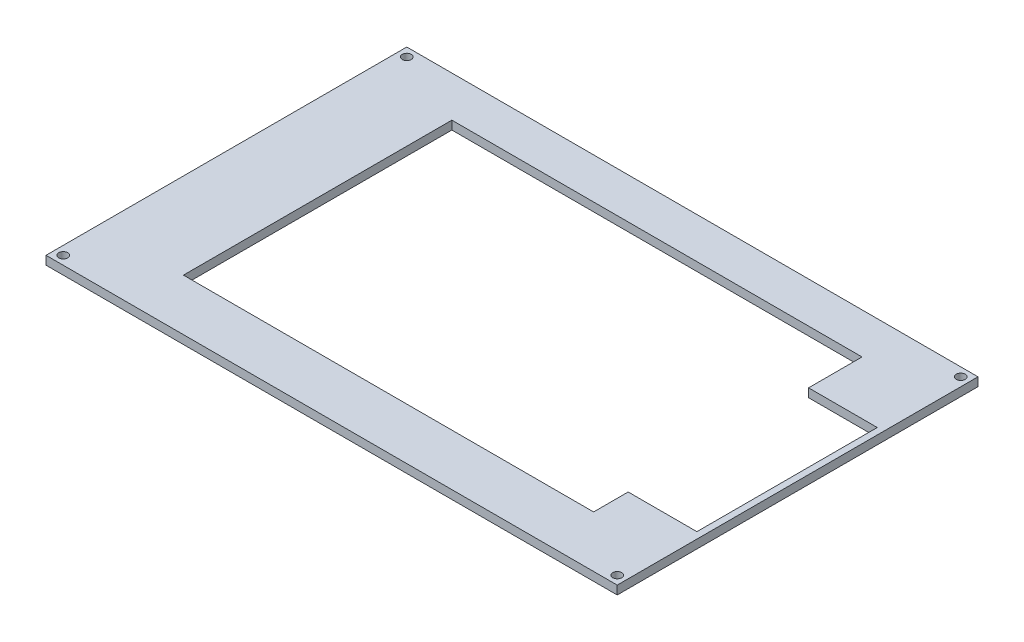
ISO-10303-21;
HEADER;
FILE_DESCRIPTION(('STEP AP214'),'2;1');
FILE_NAME('part.step','',(''),(''),'','','');
FILE_SCHEMA(('AUTOMOTIVE_DESIGN { 1 0 10303 214 1 1 1 1 }'));
ENDSEC;
DATA;
#1=APPLICATION_CONTEXT('core data for automotive mechanical design processes');
#2=APPLICATION_PROTOCOL_DEFINITION('international standard','automotive_design',2000,#1);
#3=PRODUCT_CONTEXT('',#1,'mechanical');
#4=PRODUCT('Part','Part','',(#3));
#5=PRODUCT_RELATED_PRODUCT_CATEGORY('part','',(#4));
#6=PRODUCT_DEFINITION_FORMATION('','',#4);
#7=PRODUCT_DEFINITION_CONTEXT('part definition',#1,'design');
#8=PRODUCT_DEFINITION('design','',#6,#7);
#9=PRODUCT_DEFINITION_SHAPE('','',#8);
#10=(LENGTH_UNIT() NAMED_UNIT(*) SI_UNIT(.MILLI.,.METRE.));
#11=(NAMED_UNIT(*) PLANE_ANGLE_UNIT() SI_UNIT($,.RADIAN.));
#12=(NAMED_UNIT(*) SI_UNIT($,.STERADIAN.) SOLID_ANGLE_UNIT());
#13=UNCERTAINTY_MEASURE_WITH_UNIT(LENGTH_MEASURE(1.E-05),#10,'distance_accuracy_value','');
#14=(GEOMETRIC_REPRESENTATION_CONTEXT(3) GLOBAL_UNCERTAINTY_ASSIGNED_CONTEXT((#13)) GLOBAL_UNIT_ASSIGNED_CONTEXT((#10,
#11,#12)) REPRESENTATION_CONTEXT('',''));
#15=CARTESIAN_POINT('',(0.,0.,0.));
#16=DIRECTION('',(0.,0.,1.));
#17=DIRECTION('',(1.,0.,0.));
#18=AXIS2_PLACEMENT_3D('',#15,#16,#17);
#19=CARTESIAN_POINT('',(133.,2.,0.));
#20=DIRECTION('',(1.,0.,0.));
#21=DIRECTION('',(0.,0.,-1.));
#22=AXIS2_PLACEMENT_3D('',#19,#20,#21);
#23=PLANE('',#22);
#24=DIRECTION('',(0.,0.,1.));
#25=VECTOR('',#24,1.);
#26=CARTESIAN_POINT('',(133.,0.,0.));
#27=LINE('',#26,#25);
#28=CARTESIAN_POINT('',(133.,0.,0.));
#29=VERTEX_POINT('',#28);
#30=CARTESIAN_POINT('',(133.,0.,84.));
#31=VERTEX_POINT('',#30);
#32=EDGE_CURVE('E216',#29,#31,#27,.T.);
#33=ORIENTED_EDGE('',*,*,#32,.F.);
#34=DIRECTION('',(0.,-1.,0.));
#35=VECTOR('',#34,1.);
#36=CARTESIAN_POINT('',(133.,2.,0.));
#37=LINE('',#36,#35);
#38=CARTESIAN_POINT('',(133.,2.,0.));
#39=VERTEX_POINT('',#38);
#40=EDGE_CURVE('E11',#39,#29,#37,.T.);
#41=ORIENTED_EDGE('',*,*,#40,.F.);
#42=DIRECTION('',(0.,0.,1.));
#43=VECTOR('',#42,1.);
#44=CARTESIAN_POINT('',(133.,2.,0.));
#45=LINE('',#44,#43);
#46=CARTESIAN_POINT('',(133.,2.,84.));
#47=VERTEX_POINT('',#46);
#48=EDGE_CURVE('E160',#39,#47,#45,.T.);
#49=ORIENTED_EDGE('',*,*,#48,.T.);
#50=DIRECTION('',(0.,-1.,0.));
#51=VECTOR('',#50,1.);
#52=CARTESIAN_POINT('',(133.,2.,84.));
#53=LINE('',#52,#51);
#54=EDGE_CURVE('E108',#47,#31,#53,.T.);
#55=ORIENTED_EDGE('',*,*,#54,.T.);
#56=EDGE_LOOP('',(#33,#41,#49,#55));
#57=FACE_BOUND('',#56,.T.);
#58=ADVANCED_FACE('F41',(#57),#23,.T.);
#59=CARTESIAN_POINT('',(0.,2.,0.));
#60=DIRECTION('',(0.,0.,-1.));
#61=DIRECTION('',(-1.,0.,0.));
#62=AXIS2_PLACEMENT_3D('',#59,#60,#61);
#63=PLANE('',#62);
#64=DIRECTION('',(1.,0.,0.));
#65=VECTOR('',#64,1.);
#66=CARTESIAN_POINT('',(0.,0.,0.));
#67=LINE('',#66,#65);
#68=CARTESIAN_POINT('',(0.,0.,0.));
#69=VERTEX_POINT('',#68);
#70=EDGE_CURVE('E148',#69,#29,#67,.T.);
#71=ORIENTED_EDGE('',*,*,#70,.F.);
#72=DIRECTION('',(0.,-1.,0.));
#73=VECTOR('',#72,1.);
#74=CARTESIAN_POINT('',(0.,2.,0.));
#75=LINE('',#74,#73);
#76=CARTESIAN_POINT('',(0.,2.,0.));
#77=VERTEX_POINT('',#76);
#78=EDGE_CURVE('E52',#77,#69,#75,.T.);
#79=ORIENTED_EDGE('',*,*,#78,.F.);
#80=DIRECTION('',(1.,0.,0.));
#81=VECTOR('',#80,1.);
#82=CARTESIAN_POINT('',(0.,2.,0.));
#83=LINE('',#82,#81);
#84=EDGE_CURVE('E146',#77,#39,#83,.T.);
#85=ORIENTED_EDGE('',*,*,#84,.T.);
#86=ORIENTED_EDGE('',*,*,#40,.T.);
#87=EDGE_LOOP('',(#71,#79,#85,#86));
#88=FACE_BOUND('',#87,.T.);
#89=ADVANCED_FACE('F144',(#88),#63,.T.);
#90=CARTESIAN_POINT('',(0.,2.,0.));
#91=DIRECTION('',(1.,0.,0.));
#92=DIRECTION('',(0.,0.,-1.));
#93=AXIS2_PLACEMENT_3D('',#90,#91,#92);
#94=PLANE('',#93);
#95=DIRECTION('',(0.,0.,1.));
#96=VECTOR('',#95,1.);
#97=CARTESIAN_POINT('',(0.,0.,0.));
#98=LINE('',#97,#96);
#99=CARTESIAN_POINT('',(0.,0.,84.));
#100=VERTEX_POINT('',#99);
#101=EDGE_CURVE('E221',#69,#100,#98,.T.);
#102=ORIENTED_EDGE('',*,*,#101,.T.);
#103=DIRECTION('',(0.,-1.,0.));
#104=VECTOR('',#103,1.);
#105=CARTESIAN_POINT('',(0.,2.,84.));
#106=LINE('',#105,#104);
#107=CARTESIAN_POINT('',(0.,2.,84.));
#108=VERTEX_POINT('',#107);
#109=EDGE_CURVE('E152',#108,#100,#106,.T.);
#110=ORIENTED_EDGE('',*,*,#109,.F.);
#111=DIRECTION('',(0.,0.,1.));
#112=VECTOR('',#111,1.);
#113=CARTESIAN_POINT('',(0.,2.,0.));
#114=LINE('',#113,#112);
#115=EDGE_CURVE('E155',#77,#108,#114,.T.);
#116=ORIENTED_EDGE('',*,*,#115,.F.);
#117=ORIENTED_EDGE('',*,*,#78,.T.);
#118=EDGE_LOOP('',(#102,#110,#116,#117));
#119=FACE_BOUND('',#118,.T.);
#120=ADVANCED_FACE('F156',(#119),#94,.F.);
#121=CARTESIAN_POINT('',(131.5,2.,0.));
#122=DIRECTION('',(-1.,0.,0.));
#123=DIRECTION('',(0.,0.,1.));
#124=AXIS2_PLACEMENT_3D('',#121,#122,#123);
#125=PLANE('',#124);
#126=DIRECTION('',(0.,0.,-1.));
#127=VECTOR('',#126,1.);
#128=CARTESIAN_POINT('',(131.5,0.,0.));
#129=LINE('',#128,#127);
#130=CARTESIAN_POINT('',(131.5,0.,63.95));
#131=VERTEX_POINT('',#130);
#132=CARTESIAN_POINT('',(131.5,0.,21.95));
#133=VERTEX_POINT('',#132);
#134=EDGE_CURVE('E187',#131,#133,#129,.T.);
#135=ORIENTED_EDGE('',*,*,#134,.F.);
#136=DIRECTION('',(0.,-1.,0.));
#137=VECTOR('',#136,1.);
#138=CARTESIAN_POINT('',(131.5,2.,63.95));
#139=LINE('',#138,#137);
#140=CARTESIAN_POINT('',(131.5,2.,63.95));
#141=VERTEX_POINT('',#140);
#142=EDGE_CURVE('E45',#141,#131,#139,.T.);
#143=ORIENTED_EDGE('',*,*,#142,.F.);
#144=DIRECTION('',(0.,0.,-1.));
#145=VECTOR('',#144,1.);
#146=CARTESIAN_POINT('',(131.5,2.,0.));
#147=LINE('',#146,#145);
#148=CARTESIAN_POINT('',(131.5,2.,21.95));
#149=VERTEX_POINT('',#148);
#150=EDGE_CURVE('E301',#141,#149,#147,.T.);
#151=ORIENTED_EDGE('',*,*,#150,.T.);
#152=DIRECTION('',(0.,-1.,0.));
#153=VECTOR('',#152,1.);
#154=CARTESIAN_POINT('',(131.5,2.,21.95));
#155=LINE('',#154,#153);
#156=EDGE_CURVE('E170',#149,#133,#155,.T.);
#157=ORIENTED_EDGE('',*,*,#156,.T.);
#158=EDGE_LOOP('',(#135,#143,#151,#157));
#159=FACE_BOUND('',#158,.T.);
#160=ADVANCED_FACE('F261',(#159),#125,.T.);
#161=CARTESIAN_POINT('',(0.,2.,63.95));
#162=DIRECTION('',(0.,0.,-1.));
#163=DIRECTION('',(-1.,0.,0.));
#164=AXIS2_PLACEMENT_3D('',#161,#162,#163);
#165=PLANE('',#164);
#166=DIRECTION('',(1.,0.,0.));
#167=VECTOR('',#166,1.);
#168=CARTESIAN_POINT('',(0.,0.,63.95));
#169=LINE('',#168,#167);
#170=CARTESIAN_POINT('',(115.5,0.,63.95));
#171=VERTEX_POINT('',#170);
#172=EDGE_CURVE('E191',#171,#131,#169,.T.);
#173=ORIENTED_EDGE('',*,*,#172,.F.);
#174=DIRECTION('',(0.,-1.,0.));
#175=VECTOR('',#174,1.);
#176=CARTESIAN_POINT('',(115.5,2.,63.95));
#177=LINE('',#176,#175);
#178=CARTESIAN_POINT('',(115.5,2.,63.95));
#179=VERTEX_POINT('',#178);
#180=EDGE_CURVE('E249',#179,#171,#177,.T.);
#181=ORIENTED_EDGE('',*,*,#180,.F.);
#182=DIRECTION('',(1.,0.,0.));
#183=VECTOR('',#182,1.);
#184=CARTESIAN_POINT('',(0.,2.,63.95));
#185=LINE('',#184,#183);
#186=EDGE_CURVE('E260',#179,#141,#185,.T.);
#187=ORIENTED_EDGE('',*,*,#186,.T.);
#188=ORIENTED_EDGE('',*,*,#142,.T.);
#189=EDGE_LOOP('',(#173,#181,#187,#188));
#190=FACE_BOUND('',#189,.T.);
#191=ADVANCED_FACE('F258',(#190),#165,.T.);
#192=CARTESIAN_POINT('',(115.5,2.,0.));
#193=DIRECTION('',(1.,0.,0.));
#194=DIRECTION('',(0.,0.,-1.));
#195=AXIS2_PLACEMENT_3D('',#192,#193,#194);
#196=PLANE('',#195);
#197=DIRECTION('',(0.,0.,1.));
#198=VECTOR('',#197,1.);
#199=CARTESIAN_POINT('',(115.5,0.,0.));
#200=LINE('',#199,#198);
#201=CARTESIAN_POINT('',(115.5,0.,72.));
#202=VERTEX_POINT('',#201);
#203=EDGE_CURVE('E195',#171,#202,#200,.T.);
#204=ORIENTED_EDGE('',*,*,#203,.T.);
#205=DIRECTION('',(0.,-1.,0.));
#206=VECTOR('',#205,1.);
#207=CARTESIAN_POINT('',(115.5,2.,72.));
#208=LINE('',#207,#206);
#209=CARTESIAN_POINT('',(115.5,2.,72.));
#210=VERTEX_POINT('',#209);
#211=EDGE_CURVE('E247',#210,#202,#208,.T.);
#212=ORIENTED_EDGE('',*,*,#211,.F.);
#213=DIRECTION('',(0.,0.,1.));
#214=VECTOR('',#213,1.);
#215=CARTESIAN_POINT('',(115.5,2.,0.));
#216=LINE('',#215,#214);
#217=EDGE_CURVE('E269',#179,#210,#216,.T.);
#218=ORIENTED_EDGE('',*,*,#217,.F.);
#219=ORIENTED_EDGE('',*,*,#180,.T.);
#220=EDGE_LOOP('',(#204,#212,#218,#219));
#221=FACE_BOUND('',#220,.T.);
#222=ADVANCED_FACE('F267',(#221),#196,.F.);
#223=CARTESIAN_POINT('',(0.,2.,72.));
#224=DIRECTION('',(0.,0.,-1.));
#225=DIRECTION('',(-1.,0.,0.));
#226=AXIS2_PLACEMENT_3D('',#223,#224,#225);
#227=PLANE('',#226);
#228=DIRECTION('',(1.,0.,0.));
#229=VECTOR('',#228,1.);
#230=CARTESIAN_POINT('',(0.,0.,72.));
#231=LINE('',#230,#229);
#232=CARTESIAN_POINT('',(20.,0.,72.));
#233=VERTEX_POINT('',#232);
#234=EDGE_CURVE('E199',#233,#202,#231,.T.);
#235=ORIENTED_EDGE('',*,*,#234,.F.);
#236=DIRECTION('',(0.,-1.,0.));
#237=VECTOR('',#236,1.);
#238=CARTESIAN_POINT('',(20.,2.,72.));
#239=LINE('',#238,#237);
#240=CARTESIAN_POINT('',(20.,2.,72.));
#241=VERTEX_POINT('',#240);
#242=EDGE_CURVE('E244',#241,#233,#239,.T.);
#243=ORIENTED_EDGE('',*,*,#242,.F.);
#244=DIRECTION('',(1.,0.,0.));
#245=VECTOR('',#244,1.);
#246=CARTESIAN_POINT('',(0.,2.,72.));
#247=LINE('',#246,#245);
#248=EDGE_CURVE('E272',#241,#210,#247,.T.);
#249=ORIENTED_EDGE('',*,*,#248,.T.);
#250=ORIENTED_EDGE('',*,*,#211,.T.);
#251=EDGE_LOOP('',(#235,#243,#249,#250));
#252=FACE_BOUND('',#251,.T.);
#253=ADVANCED_FACE('F273',(#252),#227,.T.);
#254=CARTESIAN_POINT('',(20.,2.,0.));
#255=DIRECTION('',(1.,0.,0.));
#256=DIRECTION('',(0.,0.,-1.));
#257=AXIS2_PLACEMENT_3D('',#254,#255,#256);
#258=PLANE('',#257);
#259=DIRECTION('',(0.,0.,1.));
#260=VECTOR('',#259,1.);
#261=CARTESIAN_POINT('',(20.,0.,0.));
#262=LINE('',#261,#260);
#263=CARTESIAN_POINT('',(20.,0.,9.50000000000001));
#264=VERTEX_POINT('',#263);
#265=EDGE_CURVE('E204',#264,#233,#262,.T.);
#266=ORIENTED_EDGE('',*,*,#265,.F.);
#267=DIRECTION('',(0.,-1.,0.));
#268=VECTOR('',#267,1.);
#269=CARTESIAN_POINT('',(20.,2.,9.50000000000001));
#270=LINE('',#269,#268);
#271=CARTESIAN_POINT('',(20.,2.,9.50000000000001));
#272=VERTEX_POINT('',#271);
#273=EDGE_CURVE('E241',#272,#264,#270,.T.);
#274=ORIENTED_EDGE('',*,*,#273,.F.);
#275=DIRECTION('',(0.,0.,1.));
#276=VECTOR('',#275,1.);
#277=CARTESIAN_POINT('',(20.,2.,0.));
#278=LINE('',#277,#276);
#279=EDGE_CURVE('E278',#272,#241,#278,.T.);
#280=ORIENTED_EDGE('',*,*,#279,.T.);
#281=ORIENTED_EDGE('',*,*,#242,.T.);
#282=EDGE_LOOP('',(#266,#274,#280,#281));
#283=FACE_BOUND('',#282,.T.);
#284=ADVANCED_FACE('F363',(#283),#258,.T.);
#285=CARTESIAN_POINT('',(0.,2.,9.50000000000001));
#286=DIRECTION('',(0.,0.,-1.));
#287=DIRECTION('',(-1.,0.,0.));
#288=AXIS2_PLACEMENT_3D('',#285,#286,#287);
#289=PLANE('',#288);
#290=DIRECTION('',(1.,0.,0.));
#291=VECTOR('',#290,1.);
#292=CARTESIAN_POINT('',(0.,0.,9.50000000000001));
#293=LINE('',#292,#291);
#294=CARTESIAN_POINT('',(115.5,0.,9.50000000000001));
#295=VERTEX_POINT('',#294);
#296=EDGE_CURVE('E208',#264,#295,#293,.T.);
#297=ORIENTED_EDGE('',*,*,#296,.T.);
#298=DIRECTION('',(0.,-1.,0.));
#299=VECTOR('',#298,1.);
#300=CARTESIAN_POINT('',(115.5,2.,9.50000000000001));
#301=LINE('',#300,#299);
#302=CARTESIAN_POINT('',(115.5,2.,9.50000000000001));
#303=VERTEX_POINT('',#302);
#304=EDGE_CURVE('E237',#303,#295,#301,.T.);
#305=ORIENTED_EDGE('',*,*,#304,.F.);
#306=DIRECTION('',(1.,0.,0.));
#307=VECTOR('',#306,1.);
#308=CARTESIAN_POINT('',(0.,2.,9.50000000000001));
#309=LINE('',#308,#307);
#310=EDGE_CURVE('E282',#272,#303,#309,.T.);
#311=ORIENTED_EDGE('',*,*,#310,.F.);
#312=ORIENTED_EDGE('',*,*,#273,.T.);
#313=EDGE_LOOP('',(#297,#305,#311,#312));
#314=FACE_BOUND('',#313,.T.);
#315=ADVANCED_FACE('F360',(#314),#289,.F.);
#316=CARTESIAN_POINT('',(115.5,0.,21.95));
#317=VERTEX_POINT('',#316);
#318=EDGE_CURVE('E200',#295,#317,#200,.T.);
#319=ORIENTED_EDGE('',*,*,#318,.T.);
#320=DIRECTION('',(0.,-1.,0.));
#321=VECTOR('',#320,1.);
#322=CARTESIAN_POINT('',(115.5,2.,21.95));
#323=LINE('',#322,#321);
#324=CARTESIAN_POINT('',(115.5,2.,21.95));
#325=VERTEX_POINT('',#324);
#326=EDGE_CURVE('E233',#325,#317,#323,.T.);
#327=ORIENTED_EDGE('',*,*,#326,.F.);
#328=EDGE_CURVE('E285',#303,#325,#216,.T.);
#329=ORIENTED_EDGE('',*,*,#328,.F.);
#330=ORIENTED_EDGE('',*,*,#304,.T.);
#331=EDGE_LOOP('',(#319,#327,#329,#330));
#332=FACE_BOUND('',#331,.T.);
#333=ADVANCED_FACE('F298',(#332),#196,.F.);
#334=CARTESIAN_POINT('',(0.,2.,21.95));
#335=DIRECTION('',(0.,0.,-1.));
#336=DIRECTION('',(-1.,0.,0.));
#337=AXIS2_PLACEMENT_3D('',#334,#335,#336);
#338=PLANE('',#337);
#339=DIRECTION('',(1.,0.,0.));
#340=VECTOR('',#339,1.);
#341=CARTESIAN_POINT('',(0.,0.,21.95));
#342=LINE('',#341,#340);
#343=EDGE_CURVE('E212',#317,#133,#342,.T.);
#344=ORIENTED_EDGE('',*,*,#343,.T.);
#345=ORIENTED_EDGE('',*,*,#156,.F.);
#346=DIRECTION('',(1.,0.,0.));
#347=VECTOR('',#346,1.);
#348=CARTESIAN_POINT('',(0.,2.,21.95));
#349=LINE('',#348,#347);
#350=EDGE_CURVE('E164',#325,#149,#349,.T.);
#351=ORIENTED_EDGE('',*,*,#350,.F.);
#352=ORIENTED_EDGE('',*,*,#326,.T.);
#353=EDGE_LOOP('',(#344,#345,#351,#352));
#354=FACE_BOUND('',#353,.T.);
#355=ADVANCED_FACE('F300',(#354),#338,.F.);
#356=CARTESIAN_POINT('',(2.,2.,2.));
#357=DIRECTION('',(0.,-1.,0.));
#358=DIRECTION('',(0.,0.,-1.));
#359=AXIS2_PLACEMENT_3D('',#356,#357,#358);
#360=CYLINDRICAL_SURFACE('',#359,1.05);
#361=CARTESIAN_POINT('',(2.,2.,2.));
#362=DIRECTION('',(0.,1.,0.));
#363=DIRECTION('',(0.,0.,1.));
#364=AXIS2_PLACEMENT_3D('',#361,#362,#363);
#365=CIRCLE('',#364,1.05);
#366=CARTESIAN_POINT('',(2.,2.,3.05));
#367=VERTEX_POINT('',#366);
#368=EDGE_CURVE('E303',#367,#367,#365,.T.);
#369=ORIENTED_EDGE('',*,*,#368,.T.);
#370=EDGE_LOOP('',(#369));
#371=FACE_BOUND('',#370,.T.);
#372=CARTESIAN_POINT('',(2.,0.,2.));
#373=DIRECTION('',(0.,1.,0.));
#374=DIRECTION('',(0.,0.,1.));
#375=AXIS2_PLACEMENT_3D('',#372,#373,#374);
#376=CIRCLE('',#375,1.05);
#377=CARTESIAN_POINT('',(2.,0.,3.05));
#378=VERTEX_POINT('',#377);
#379=EDGE_CURVE('E183',#378,#378,#376,.T.);
#380=ORIENTED_EDGE('',*,*,#379,.F.);
#381=EDGE_LOOP('',(#380));
#382=FACE_BOUND('',#381,.T.);
#383=ADVANCED_FACE('F334',(#371,#382),#360,.F.);
#384=CARTESIAN_POINT('',(131.,2.,2.));
#385=DIRECTION('',(0.,-1.,0.));
#386=DIRECTION('',(0.,0.,-1.));
#387=AXIS2_PLACEMENT_3D('',#384,#385,#386);
#388=CYLINDRICAL_SURFACE('',#387,1.04999999999999);
#389=CARTESIAN_POINT('',(131.,2.,2.));
#390=DIRECTION('',(0.,1.,0.));
#391=DIRECTION('',(0.,0.,1.));
#392=AXIS2_PLACEMENT_3D('',#389,#390,#391);
#393=CIRCLE('',#392,1.04999999999999);
#394=CARTESIAN_POINT('',(131.,2.,3.04999999999999));
#395=VERTEX_POINT('',#394);
#396=EDGE_CURVE('E308',#395,#395,#393,.T.);
#397=ORIENTED_EDGE('',*,*,#396,.T.);
#398=EDGE_LOOP('',(#397));
#399=FACE_BOUND('',#398,.T.);
#400=CARTESIAN_POINT('',(131.,0.,2.));
#401=DIRECTION('',(0.,1.,0.));
#402=DIRECTION('',(0.,0.,1.));
#403=AXIS2_PLACEMENT_3D('',#400,#401,#402);
#404=CIRCLE('',#403,1.04999999999999);
#405=CARTESIAN_POINT('',(131.,0.,3.04999999999999));
#406=VERTEX_POINT('',#405);
#407=EDGE_CURVE('E179',#406,#406,#404,.T.);
#408=ORIENTED_EDGE('',*,*,#407,.F.);
#409=EDGE_LOOP('',(#408));
#410=FACE_BOUND('',#409,.T.);
#411=ADVANCED_FACE('F337',(#399,#410),#388,.F.);
#412=CARTESIAN_POINT('',(2.00000000000001,2.,82.));
#413=DIRECTION('',(0.,-1.,0.));
#414=DIRECTION('',(0.,0.,-1.));
#415=AXIS2_PLACEMENT_3D('',#412,#413,#414);
#416=CYLINDRICAL_SURFACE('',#415,1.05);
#417=CARTESIAN_POINT('',(2.00000000000001,2.,82.));
#418=DIRECTION('',(0.,1.,0.));
#419=DIRECTION('',(0.,0.,1.));
#420=AXIS2_PLACEMENT_3D('',#417,#418,#419);
#421=CIRCLE('',#420,1.05);
#422=CARTESIAN_POINT('',(2.00000000000001,2.,83.05));
#423=VERTEX_POINT('',#422);
#424=EDGE_CURVE('E314',#423,#423,#421,.T.);
#425=ORIENTED_EDGE('',*,*,#424,.T.);
#426=EDGE_LOOP('',(#425));
#427=FACE_BOUND('',#426,.T.);
#428=CARTESIAN_POINT('',(2.00000000000001,0.,82.));
#429=DIRECTION('',(0.,1.,0.));
#430=DIRECTION('',(0.,0.,1.));
#431=AXIS2_PLACEMENT_3D('',#428,#429,#430);
#432=CIRCLE('',#431,1.05);
#433=CARTESIAN_POINT('',(2.00000000000001,0.,83.05));
#434=VERTEX_POINT('',#433);
#435=EDGE_CURVE('E175',#434,#434,#432,.T.);
#436=ORIENTED_EDGE('',*,*,#435,.F.);
#437=EDGE_LOOP('',(#436));
#438=FACE_BOUND('',#437,.T.);
#439=ADVANCED_FACE('F375',(#427,#438),#416,.F.);
#440=CARTESIAN_POINT('',(131.,2.,82.));
#441=DIRECTION('',(0.,-1.,0.));
#442=DIRECTION('',(0.,0.,-1.));
#443=AXIS2_PLACEMENT_3D('',#440,#441,#442);
#444=CYLINDRICAL_SURFACE('',#443,1.04999999999999);
#445=CARTESIAN_POINT('',(131.,2.,82.));
#446=DIRECTION('',(0.,1.,0.));
#447=DIRECTION('',(0.,0.,1.));
#448=AXIS2_PLACEMENT_3D('',#445,#446,#447);
#449=CIRCLE('',#448,1.04999999999999);
#450=CARTESIAN_POINT('',(131.,2.,83.05));
#451=VERTEX_POINT('',#450);
#452=EDGE_CURVE('E226',#451,#451,#449,.T.);
#453=ORIENTED_EDGE('',*,*,#452,.T.);
#454=EDGE_LOOP('',(#453));
#455=FACE_BOUND('',#454,.T.);
#456=CARTESIAN_POINT('',(131.,0.,82.));
#457=DIRECTION('',(0.,1.,0.));
#458=DIRECTION('',(0.,0.,1.));
#459=AXIS2_PLACEMENT_3D('',#456,#457,#458);
#460=CIRCLE('',#459,1.04999999999999);
#461=CARTESIAN_POINT('',(131.,0.,83.05));
#462=VERTEX_POINT('',#461);
#463=EDGE_CURVE('E171',#462,#462,#460,.T.);
#464=ORIENTED_EDGE('',*,*,#463,.F.);
#465=EDGE_LOOP('',(#464));
#466=FACE_BOUND('',#465,.T.);
#467=ADVANCED_FACE('F43',(#455,#466),#444,.F.);
#468=CARTESIAN_POINT('',(0.,2.,84.));
#469=DIRECTION('',(0.,0.,-1.));
#470=DIRECTION('',(-1.,0.,0.));
#471=AXIS2_PLACEMENT_3D('',#468,#469,#470);
#472=PLANE('',#471);
#473=DIRECTION('',(1.,0.,0.));
#474=VECTOR('',#473,1.);
#475=CARTESIAN_POINT('',(0.,0.,84.));
#476=LINE('',#475,#474);
#477=EDGE_CURVE('E101',#100,#31,#476,.T.);
#478=ORIENTED_EDGE('',*,*,#477,.T.);
#479=ORIENTED_EDGE('',*,*,#54,.F.);
#480=DIRECTION('',(1.,0.,0.));
#481=VECTOR('',#480,1.);
#482=CARTESIAN_POINT('',(0.,2.,84.));
#483=LINE('',#482,#481);
#484=EDGE_CURVE('E61',#108,#47,#483,.T.);
#485=ORIENTED_EDGE('',*,*,#484,.F.);
#486=ORIENTED_EDGE('',*,*,#109,.T.);
#487=EDGE_LOOP('',(#478,#479,#485,#486));
#488=FACE_BOUND('',#487,.T.);
#489=ADVANCED_FACE('F326',(#488),#472,.F.);
#490=CARTESIAN_POINT('',(0.,2.,0.));
#491=DIRECTION('',(0.,1.,0.));
#492=DIRECTION('',(0.,0.,1.));
#493=AXIS2_PLACEMENT_3D('',#490,#491,#492);
#494=PLANE('',#493);
#495=ORIENTED_EDGE('',*,*,#452,.F.);
#496=EDGE_LOOP('',(#495));
#497=FACE_BOUND('',#496,.T.);
#498=ORIENTED_EDGE('',*,*,#424,.F.);
#499=EDGE_LOOP('',(#498));
#500=FACE_BOUND('',#499,.T.);
#501=ORIENTED_EDGE('',*,*,#396,.F.);
#502=EDGE_LOOP('',(#501));
#503=FACE_BOUND('',#502,.T.);
#504=ORIENTED_EDGE('',*,*,#368,.F.);
#505=EDGE_LOOP('',(#504));
#506=FACE_BOUND('',#505,.T.);
#507=ORIENTED_EDGE('',*,*,#150,.F.);
#508=ORIENTED_EDGE('',*,*,#186,.F.);
#509=ORIENTED_EDGE('',*,*,#217,.T.);
#510=ORIENTED_EDGE('',*,*,#248,.F.);
#511=ORIENTED_EDGE('',*,*,#279,.F.);
#512=ORIENTED_EDGE('',*,*,#310,.T.);
#513=ORIENTED_EDGE('',*,*,#328,.T.);
#514=ORIENTED_EDGE('',*,*,#350,.T.);
#515=EDGE_LOOP('',(#507,#508,#509,#510,#511,#512,#513,#514));
#516=FACE_BOUND('',#515,.T.);
#517=ORIENTED_EDGE('',*,*,#48,.F.);
#518=ORIENTED_EDGE('',*,*,#84,.F.);
#519=ORIENTED_EDGE('',*,*,#115,.T.);
#520=ORIENTED_EDGE('',*,*,#484,.T.);
#521=EDGE_LOOP('',(#517,#518,#519,#520));
#522=FACE_BOUND('',#521,.T.);
#523=ADVANCED_FACE('F159',(#497,#500,#503,#506,#516,#522),#494,.T.);
#524=CARTESIAN_POINT('',(0.,0.,0.));
#525=DIRECTION('',(0.,1.,0.));
#526=DIRECTION('',(0.,0.,1.));
#527=AXIS2_PLACEMENT_3D('',#524,#525,#526);
#528=PLANE('',#527);
#529=ORIENTED_EDGE('',*,*,#463,.T.);
#530=EDGE_LOOP('',(#529));
#531=FACE_BOUND('',#530,.T.);
#532=ORIENTED_EDGE('',*,*,#435,.T.);
#533=EDGE_LOOP('',(#532));
#534=FACE_BOUND('',#533,.T.);
#535=ORIENTED_EDGE('',*,*,#407,.T.);
#536=EDGE_LOOP('',(#535));
#537=FACE_BOUND('',#536,.T.);
#538=ORIENTED_EDGE('',*,*,#379,.T.);
#539=EDGE_LOOP('',(#538));
#540=FACE_BOUND('',#539,.T.);
#541=ORIENTED_EDGE('',*,*,#134,.T.);
#542=ORIENTED_EDGE('',*,*,#343,.F.);
#543=ORIENTED_EDGE('',*,*,#318,.F.);
#544=ORIENTED_EDGE('',*,*,#296,.F.);
#545=ORIENTED_EDGE('',*,*,#265,.T.);
#546=ORIENTED_EDGE('',*,*,#234,.T.);
#547=ORIENTED_EDGE('',*,*,#203,.F.);
#548=ORIENTED_EDGE('',*,*,#172,.T.);
#549=EDGE_LOOP('',(#541,#542,#543,#544,#545,#546,#547,#548));
#550=FACE_BOUND('',#549,.T.);
#551=ORIENTED_EDGE('',*,*,#32,.T.);
#552=ORIENTED_EDGE('',*,*,#477,.F.);
#553=ORIENTED_EDGE('',*,*,#101,.F.);
#554=ORIENTED_EDGE('',*,*,#70,.T.);
#555=EDGE_LOOP('',(#551,#552,#553,#554));
#556=FACE_BOUND('',#555,.T.);
#557=ADVANCED_FACE('F264',(#531,#534,#537,#540,#550,#556),#528,.F.);
#558=CLOSED_SHELL('',(#58,#89,#120,#160,#191,#222,#253,#284,#315,#333,#355,#383,#411,#439,#467,
#489,#523,#557));
#559=MANIFOLD_SOLID_BREP('B2',#558);
#560=ADVANCED_BREP_SHAPE_REPRESENTATION('',(#18,#559),#14);
#561=SHAPE_DEFINITION_REPRESENTATION(#9,#560);
ENDSEC;
END-ISO-10303-21;
